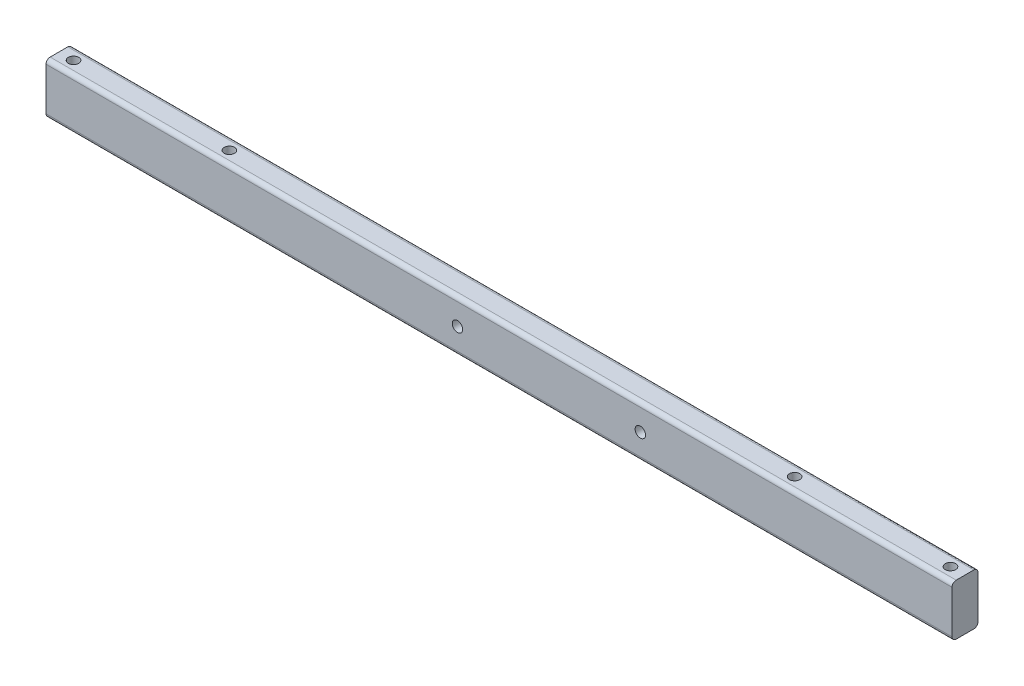
ISO-10303-21;
HEADER;
FILE_DESCRIPTION(('STEP AP214'),'2;1');
FILE_NAME('part.step','',(''),(''),'','','');
FILE_SCHEMA(('AUTOMOTIVE_DESIGN { 1 0 10303 214 1 1 1 1 }'));
ENDSEC;
DATA;
#1=APPLICATION_CONTEXT('core data for automotive mechanical design processes');
#2=APPLICATION_PROTOCOL_DEFINITION('international standard','automotive_design',2000,#1);
#3=PRODUCT_CONTEXT('',#1,'mechanical');
#4=PRODUCT('Part','Part','',(#3));
#5=PRODUCT_RELATED_PRODUCT_CATEGORY('part','',(#4));
#6=PRODUCT_DEFINITION_FORMATION('','',#4);
#7=PRODUCT_DEFINITION_CONTEXT('part definition',#1,'design');
#8=PRODUCT_DEFINITION('design','',#6,#7);
#9=PRODUCT_DEFINITION_SHAPE('','',#8);
#10=(LENGTH_UNIT() NAMED_UNIT(*) SI_UNIT(.MILLI.,.METRE.));
#11=(NAMED_UNIT(*) PLANE_ANGLE_UNIT() SI_UNIT($,.RADIAN.));
#12=(NAMED_UNIT(*) SI_UNIT($,.STERADIAN.) SOLID_ANGLE_UNIT());
#13=UNCERTAINTY_MEASURE_WITH_UNIT(LENGTH_MEASURE(1.E-05),#10,'distance_accuracy_value','');
#14=(GEOMETRIC_REPRESENTATION_CONTEXT(3) GLOBAL_UNCERTAINTY_ASSIGNED_CONTEXT((#13)) GLOBAL_UNIT_ASSIGNED_CONTEXT((#10,
#11,#12)) REPRESENTATION_CONTEXT('',''));
#15=CARTESIAN_POINT('',(0.,0.,0.));
#16=DIRECTION('',(0.,0.,1.));
#17=DIRECTION('',(1.,0.,0.));
#18=AXIS2_PLACEMENT_3D('',#15,#16,#17);
#19=CARTESIAN_POINT('',(0.,0.,6.25));
#20=DIRECTION('',(0.,0.,-1.));
#21=DIRECTION('',(-1.,0.,0.));
#22=AXIS2_PLACEMENT_3D('',#19,#20,#21);
#23=PLANE('',#22);
#24=DIRECTION('',(0.,-1.,0.));
#25=VECTOR('',#24,1.);
#26=CARTESIAN_POINT('',(0.,0.,6.25));
#27=LINE('',#26,#25);
#28=CARTESIAN_POINT('',(0.,11.3,6.25));
#29=VERTEX_POINT('',#28);
#30=CARTESIAN_POINT('',(0.,1.,6.25));
#31=VERTEX_POINT('',#30);
#32=EDGE_CURVE('E108',#29,#31,#27,.T.);
#33=ORIENTED_EDGE('',*,*,#32,.T.);
#34=DIRECTION('',(1.,0.,0.));
#35=VECTOR('',#34,1.);
#36=CARTESIAN_POINT('',(0.,1.,6.25));
#37=LINE('',#36,#35);
#38=CARTESIAN_POINT('',(218.,1.,6.25));
#39=VERTEX_POINT('',#38);
#40=EDGE_CURVE('E11',#31,#39,#37,.T.);
#41=ORIENTED_EDGE('',*,*,#40,.T.);
#42=DIRECTION('',(0.,1.,0.));
#43=VECTOR('',#42,1.);
#44=CARTESIAN_POINT('',(218.,0.,6.25));
#45=LINE('',#44,#43);
#46=CARTESIAN_POINT('',(218.,11.3,6.25));
#47=VERTEX_POINT('',#46);
#48=EDGE_CURVE('E124',#39,#47,#45,.T.);
#49=ORIENTED_EDGE('',*,*,#48,.T.);
#50=DIRECTION('',(-1.,0.,0.));
#51=VECTOR('',#50,1.);
#52=CARTESIAN_POINT('',(0.,11.3,6.25));
#53=LINE('',#52,#51);
#54=EDGE_CURVE('E44',#47,#29,#53,.T.);
#55=ORIENTED_EDGE('',*,*,#54,.T.);
#56=EDGE_LOOP('',(#33,#41,#49,#55));
#57=FACE_BOUND('',#56,.T.);
#58=CARTESIAN_POINT('',(143.,6.15,6.25));
#59=DIRECTION('',(0.,0.,1.));
#60=DIRECTION('',(1.,0.,0.));
#61=AXIS2_PLACEMENT_3D('',#58,#59,#60);
#62=CIRCLE('',#61,1.25000000000001);
#63=CARTESIAN_POINT('',(144.25,6.15,6.25));
#64=VERTEX_POINT('',#63);
#65=EDGE_CURVE('E165',#64,#64,#62,.T.);
#66=ORIENTED_EDGE('',*,*,#65,.F.);
#67=EDGE_LOOP('',(#66));
#68=FACE_BOUND('',#67,.T.);
#69=CARTESIAN_POINT('',(99.,6.15,6.25));
#70=DIRECTION('',(0.,0.,1.));
#71=DIRECTION('',(1.,0.,0.));
#72=AXIS2_PLACEMENT_3D('',#69,#70,#71);
#73=CIRCLE('',#72,1.25);
#74=CARTESIAN_POINT('',(100.25,6.15,6.25));
#75=VERTEX_POINT('',#74);
#76=EDGE_CURVE('E396',#75,#75,#73,.T.);
#77=ORIENTED_EDGE('',*,*,#76,.F.);
#78=EDGE_LOOP('',(#77));
#79=FACE_BOUND('',#78,.T.);
#80=ADVANCED_FACE('F36',(#57,#68,#79),#23,.F.);
#81=CARTESIAN_POINT('',(0.,0.,0.));
#82=DIRECTION('',(0.,0.,-1.));
#83=DIRECTION('',(-1.,0.,0.));
#84=AXIS2_PLACEMENT_3D('',#81,#82,#83);
#85=PLANE('',#84);
#86=CARTESIAN_POINT('',(143.,6.15,0.));
#87=DIRECTION('',(0.,0.,1.));
#88=DIRECTION('',(1.,0.,0.));
#89=AXIS2_PLACEMENT_3D('',#86,#87,#88);
#90=CIRCLE('',#89,1.25000000000001);
#91=CARTESIAN_POINT('',(144.25,6.15,0.));
#92=VERTEX_POINT('',#91);
#93=EDGE_CURVE('E399',#92,#92,#90,.T.);
#94=ORIENTED_EDGE('',*,*,#93,.T.);
#95=EDGE_LOOP('',(#94));
#96=FACE_BOUND('',#95,.T.);
#97=DIRECTION('',(0.,-1.,0.));
#98=VECTOR('',#97,1.);
#99=CARTESIAN_POINT('',(0.,0.,0.));
#100=LINE('',#99,#98);
#101=CARTESIAN_POINT('',(0.,11.3,0.));
#102=VERTEX_POINT('',#101);
#103=CARTESIAN_POINT('',(0.,1.,0.));
#104=VERTEX_POINT('',#103);
#105=EDGE_CURVE('E162',#102,#104,#100,.T.);
#106=ORIENTED_EDGE('',*,*,#105,.F.);
#107=DIRECTION('',(-1.,0.,0.));
#108=VECTOR('',#107,1.);
#109=CARTESIAN_POINT('',(218.,11.3,0.));
#110=LINE('',#109,#108);
#111=CARTESIAN_POINT('',(218.,11.3,0.));
#112=VERTEX_POINT('',#111);
#113=EDGE_CURVE('E143',#102,#112,#110,.F.);
#114=ORIENTED_EDGE('',*,*,#113,.T.);
#115=DIRECTION('',(0.,1.,0.));
#116=VECTOR('',#115,1.);
#117=CARTESIAN_POINT('',(218.,0.,0.));
#118=LINE('',#117,#116);
#119=CARTESIAN_POINT('',(218.,1.,0.));
#120=VERTEX_POINT('',#119);
#121=EDGE_CURVE('E158',#120,#112,#118,.T.);
#122=ORIENTED_EDGE('',*,*,#121,.F.);
#123=DIRECTION('',(1.,0.,0.));
#124=VECTOR('',#123,1.);
#125=CARTESIAN_POINT('',(0.,1.,0.));
#126=LINE('',#125,#124);
#127=EDGE_CURVE('E141',#120,#104,#126,.F.);
#128=ORIENTED_EDGE('',*,*,#127,.T.);
#129=EDGE_LOOP('',(#106,#114,#122,#128));
#130=FACE_BOUND('',#129,.T.);
#131=CARTESIAN_POINT('',(99.,6.15,0.));
#132=DIRECTION('',(0.,0.,1.));
#133=DIRECTION('',(1.,0.,0.));
#134=AXIS2_PLACEMENT_3D('',#131,#132,#133);
#135=CIRCLE('',#134,1.25);
#136=CARTESIAN_POINT('',(100.25,6.15,0.));
#137=VERTEX_POINT('',#136);
#138=EDGE_CURVE('E376',#137,#137,#135,.T.);
#139=ORIENTED_EDGE('',*,*,#138,.T.);
#140=EDGE_LOOP('',(#139));
#141=FACE_BOUND('',#140,.T.);
#142=ADVANCED_FACE('F181',(#96,#130,#141),#85,.T.);
#143=CARTESIAN_POINT('',(0.,0.,6.25));
#144=DIRECTION('',(1.,0.,0.));
#145=DIRECTION('',(0.,0.,-1.));
#146=AXIS2_PLACEMENT_3D('',#143,#144,#145);
#147=PLANE('',#146);
#148=DIRECTION('',(0.,0.,-1.));
#149=VECTOR('',#148,1.);
#150=CARTESIAN_POINT('',(0.,12.3,6.25));
#151=LINE('',#150,#149);
#152=CARTESIAN_POINT('',(0.,12.3,5.25));
#153=VERTEX_POINT('',#152);
#154=CARTESIAN_POINT('',(0.,12.3,1.));
#155=VERTEX_POINT('',#154);
#156=EDGE_CURVE('E106',#153,#155,#151,.T.);
#157=ORIENTED_EDGE('',*,*,#156,.T.);
#158=CARTESIAN_POINT('',(0.,11.3,1.));
#159=DIRECTION('',(1.,0.,0.));
#160=DIRECTION('',(0.,0.,-1.));
#161=AXIS2_PLACEMENT_3D('',#158,#159,#160);
#162=CIRCLE('',#161,1.);
#163=EDGE_CURVE('E139',#155,#102,#162,.F.);
#164=ORIENTED_EDGE('',*,*,#163,.T.);
#165=ORIENTED_EDGE('',*,*,#105,.T.);
#166=CARTESIAN_POINT('',(0.,1.,1.));
#167=DIRECTION('',(1.,0.,0.));
#168=DIRECTION('',(0.,0.,-1.));
#169=AXIS2_PLACEMENT_3D('',#166,#167,#168);
#170=CIRCLE('',#169,1.);
#171=CARTESIAN_POINT('',(0.,0.,1.));
#172=VERTEX_POINT('',#171);
#173=EDGE_CURVE('E137',#104,#172,#170,.F.);
#174=ORIENTED_EDGE('',*,*,#173,.T.);
#175=DIRECTION('',(0.,0.,-1.));
#176=VECTOR('',#175,1.);
#177=CARTESIAN_POINT('',(0.,0.,6.25));
#178=LINE('',#177,#176);
#179=CARTESIAN_POINT('',(0.,0.,5.25));
#180=VERTEX_POINT('',#179);
#181=EDGE_CURVE('E128',#180,#172,#178,.T.);
#182=ORIENTED_EDGE('',*,*,#181,.F.);
#183=CARTESIAN_POINT('',(0.,1.,5.25));
#184=DIRECTION('',(1.,0.,0.));
#185=DIRECTION('',(0.,0.,-1.));
#186=AXIS2_PLACEMENT_3D('',#183,#184,#185);
#187=CIRCLE('',#186,1.);
#188=EDGE_CURVE('E113',#180,#31,#187,.F.);
#189=ORIENTED_EDGE('',*,*,#188,.T.);
#190=ORIENTED_EDGE('',*,*,#32,.F.);
#191=CARTESIAN_POINT('',(0.,11.3,5.25));
#192=DIRECTION('',(1.,0.,0.));
#193=DIRECTION('',(0.,0.,-1.));
#194=AXIS2_PLACEMENT_3D('',#191,#192,#193);
#195=CIRCLE('',#194,1.);
#196=EDGE_CURVE('E103',#29,#153,#195,.F.);
#197=ORIENTED_EDGE('',*,*,#196,.T.);
#198=EDGE_LOOP('',(#157,#164,#165,#174,#182,#189,#190,#197));
#199=FACE_BOUND('',#198,.T.);
#200=ADVANCED_FACE('F105',(#199),#147,.F.);
#201=CARTESIAN_POINT('',(0.,0.,6.25));
#202=DIRECTION('',(0.,1.,0.));
#203=DIRECTION('',(0.,0.,1.));
#204=AXIS2_PLACEMENT_3D('',#201,#202,#203);
#205=PLANE('',#204);
#206=ORIENTED_EDGE('',*,*,#181,.T.);
#207=DIRECTION('',(1.,0.,0.));
#208=VECTOR('',#207,1.);
#209=CARTESIAN_POINT('',(218.,0.,1.));
#210=LINE('',#209,#208);
#211=CARTESIAN_POINT('',(218.,0.,1.));
#212=VERTEX_POINT('',#211);
#213=EDGE_CURVE('E152',#172,#212,#210,.T.);
#214=ORIENTED_EDGE('',*,*,#213,.T.);
#215=DIRECTION('',(0.,0.,-1.));
#216=VECTOR('',#215,1.);
#217=CARTESIAN_POINT('',(218.,0.,6.25));
#218=LINE('',#217,#216);
#219=CARTESIAN_POINT('',(218.,0.,5.25));
#220=VERTEX_POINT('',#219);
#221=EDGE_CURVE('E132',#220,#212,#218,.T.);
#222=ORIENTED_EDGE('',*,*,#221,.F.);
#223=DIRECTION('',(1.,0.,0.));
#224=VECTOR('',#223,1.);
#225=CARTESIAN_POINT('',(0.,0.,5.25));
#226=LINE('',#225,#224);
#227=EDGE_CURVE('E150',#220,#180,#226,.F.);
#228=ORIENTED_EDGE('',*,*,#227,.T.);
#229=EDGE_LOOP('',(#206,#214,#222,#228));
#230=FACE_BOUND('',#229,.T.);
#231=ADVANCED_FACE('F172',(#230),#205,.F.);
#232=CARTESIAN_POINT('',(218.,0.,6.25));
#233=DIRECTION('',(-1.,0.,0.));
#234=DIRECTION('',(0.,0.,1.));
#235=AXIS2_PLACEMENT_3D('',#232,#233,#234);
#236=PLANE('',#235);
#237=ORIENTED_EDGE('',*,*,#121,.T.);
#238=CARTESIAN_POINT('',(218.,11.3,1.));
#239=DIRECTION('',(-1.,0.,0.));
#240=DIRECTION('',(0.,0.,1.));
#241=AXIS2_PLACEMENT_3D('',#238,#239,#240);
#242=CIRCLE('',#241,1.);
#243=CARTESIAN_POINT('',(218.,12.3,1.));
#244=VERTEX_POINT('',#243);
#245=EDGE_CURVE('E148',#112,#244,#242,.F.);
#246=ORIENTED_EDGE('',*,*,#245,.T.);
#247=DIRECTION('',(0.,0.,-1.));
#248=VECTOR('',#247,1.);
#249=CARTESIAN_POINT('',(218.,12.3,6.25));
#250=LINE('',#249,#248);
#251=CARTESIAN_POINT('',(218.,12.3,5.25));
#252=VERTEX_POINT('',#251);
#253=EDGE_CURVE('E123',#252,#244,#250,.T.);
#254=ORIENTED_EDGE('',*,*,#253,.F.);
#255=CARTESIAN_POINT('',(218.,11.3,5.25));
#256=DIRECTION('',(-1.,0.,0.));
#257=DIRECTION('',(0.,0.,1.));
#258=AXIS2_PLACEMENT_3D('',#255,#256,#257);
#259=CIRCLE('',#258,1.);
#260=EDGE_CURVE('E127',#252,#47,#259,.F.);
#261=ORIENTED_EDGE('',*,*,#260,.T.);
#262=ORIENTED_EDGE('',*,*,#48,.F.);
#263=CARTESIAN_POINT('',(218.,1.,5.25));
#264=DIRECTION('',(-1.,0.,0.));
#265=DIRECTION('',(0.,0.,1.));
#266=AXIS2_PLACEMENT_3D('',#263,#264,#265);
#267=CIRCLE('',#266,1.);
#268=EDGE_CURVE('E59',#39,#220,#267,.F.);
#269=ORIENTED_EDGE('',*,*,#268,.T.);
#270=ORIENTED_EDGE('',*,*,#221,.T.);
#271=CARTESIAN_POINT('',(218.,1.,1.));
#272=DIRECTION('',(-1.,0.,0.));
#273=DIRECTION('',(0.,0.,1.));
#274=AXIS2_PLACEMENT_3D('',#271,#272,#273);
#275=CIRCLE('',#274,1.);
#276=EDGE_CURVE('E51',#212,#120,#275,.F.);
#277=ORIENTED_EDGE('',*,*,#276,.T.);
#278=EDGE_LOOP('',(#237,#246,#254,#261,#262,#269,#270,#277));
#279=FACE_BOUND('',#278,.T.);
#280=ADVANCED_FACE('F168',(#279),#236,.F.);
#281=CARTESIAN_POINT('',(0.,12.3,6.25));
#282=DIRECTION('',(0.,-1.,0.));
#283=DIRECTION('',(0.,0.,-1.));
#284=AXIS2_PLACEMENT_3D('',#281,#282,#283);
#285=PLANE('',#284);
#286=CARTESIAN_POINT('',(214.5,12.3,3.12499999999999));
#287=DIRECTION('',(0.,1.,0.));
#288=DIRECTION('',(0.,0.,1.));
#289=AXIS2_PLACEMENT_3D('',#286,#287,#288);
#290=CIRCLE('',#289,1.25000000000001);
#291=CARTESIAN_POINT('',(214.5,12.3,4.375));
#292=VERTEX_POINT('',#291);
#293=EDGE_CURVE('E373',#292,#292,#290,.T.);
#294=ORIENTED_EDGE('',*,*,#293,.F.);
#295=EDGE_LOOP('',(#294));
#296=FACE_BOUND('',#295,.T.);
#297=CARTESIAN_POINT('',(41.,12.3,3.12499999999999));
#298=DIRECTION('',(0.,1.,0.));
#299=DIRECTION('',(0.,0.,-1.));
#300=AXIS2_PLACEMENT_3D('',#297,#298,#299);
#301=CIRCLE('',#300,1.25000000000001);
#302=CARTESIAN_POINT('',(41.,12.3,1.87499999999998));
#303=VERTEX_POINT('',#302);
#304=EDGE_CURVE('E386',#303,#303,#301,.T.);
#305=ORIENTED_EDGE('',*,*,#304,.F.);
#306=EDGE_LOOP('',(#305));
#307=FACE_BOUND('',#306,.T.);
#308=CARTESIAN_POINT('',(3.5,12.3,3.12499999999999));
#309=DIRECTION('',(0.,1.,0.));
#310=DIRECTION('',(0.,0.,-1.));
#311=AXIS2_PLACEMENT_3D('',#308,#309,#310);
#312=CIRCLE('',#311,1.25000000000001);
#313=CARTESIAN_POINT('',(3.5,12.3,1.87499999999998));
#314=VERTEX_POINT('',#313);
#315=EDGE_CURVE('E385',#314,#314,#312,.T.);
#316=ORIENTED_EDGE('',*,*,#315,.F.);
#317=EDGE_LOOP('',(#316));
#318=FACE_BOUND('',#317,.T.);
#319=CARTESIAN_POINT('',(177.,12.3,3.12499999999999));
#320=DIRECTION('',(0.,1.,0.));
#321=DIRECTION('',(0.,0.,1.));
#322=AXIS2_PLACEMENT_3D('',#319,#320,#321);
#323=CIRCLE('',#322,1.25000000000001);
#324=CARTESIAN_POINT('',(177.,12.3,4.375));
#325=VERTEX_POINT('',#324);
#326=EDGE_CURVE('E379',#325,#325,#323,.T.);
#327=ORIENTED_EDGE('',*,*,#326,.F.);
#328=EDGE_LOOP('',(#327));
#329=FACE_BOUND('',#328,.T.);
#330=ORIENTED_EDGE('',*,*,#253,.T.);
#331=DIRECTION('',(-1.,0.,0.));
#332=VECTOR('',#331,1.);
#333=CARTESIAN_POINT('',(0.,12.3,1.));
#334=LINE('',#333,#332);
#335=EDGE_CURVE('E114',#244,#155,#334,.T.);
#336=ORIENTED_EDGE('',*,*,#335,.T.);
#337=ORIENTED_EDGE('',*,*,#156,.F.);
#338=DIRECTION('',(-1.,0.,0.));
#339=VECTOR('',#338,1.);
#340=CARTESIAN_POINT('',(0.,12.3,5.25));
#341=LINE('',#340,#339);
#342=EDGE_CURVE('E120',#153,#252,#341,.F.);
#343=ORIENTED_EDGE('',*,*,#342,.T.);
#344=EDGE_LOOP('',(#330,#336,#337,#343));
#345=FACE_BOUND('',#344,.T.);
#346=ADVANCED_FACE('F119',(#296,#307,#318,#329,#345),#285,.F.);
#347=CARTESIAN_POINT('',(143.,6.15,6.25));
#348=DIRECTION('',(0.,0.,-1.));
#349=DIRECTION('',(-1.,0.,0.));
#350=AXIS2_PLACEMENT_3D('',#347,#348,#349);
#351=CYLINDRICAL_SURFACE('',#350,1.25000000000001);
#352=ORIENTED_EDGE('',*,*,#65,.T.);
#353=EDGE_LOOP('',(#352));
#354=FACE_BOUND('',#353,.T.);
#355=ORIENTED_EDGE('',*,*,#93,.F.);
#356=EDGE_LOOP('',(#355));
#357=FACE_BOUND('',#356,.T.);
#358=ADVANCED_FACE('F207',(#354,#357),#351,.F.);
#359=CARTESIAN_POINT('',(99.,6.15,6.25));
#360=DIRECTION('',(0.,0.,-1.));
#361=DIRECTION('',(-1.,0.,0.));
#362=AXIS2_PLACEMENT_3D('',#359,#360,#361);
#363=CYLINDRICAL_SURFACE('',#362,1.25);
#364=ORIENTED_EDGE('',*,*,#76,.T.);
#365=EDGE_LOOP('',(#364));
#366=FACE_BOUND('',#365,.T.);
#367=ORIENTED_EDGE('',*,*,#138,.F.);
#368=EDGE_LOOP('',(#367));
#369=FACE_BOUND('',#368,.T.);
#370=ADVANCED_FACE('F239',(#366,#369),#363,.F.);
#371=CARTESIAN_POINT('',(177.,4.3,3.12499999999999));
#372=DIRECTION('',(0.,1.,0.));
#373=DIRECTION('',(0.,0.,1.));
#374=AXIS2_PLACEMENT_3D('',#371,#372,#373);
#375=CYLINDRICAL_SURFACE('',#374,1.25000000000001);
#376=CARTESIAN_POINT('',(177.,4.3,3.12499999999999));
#377=DIRECTION('',(0.,1.,0.));
#378=DIRECTION('',(0.,0.,1.));
#379=AXIS2_PLACEMENT_3D('',#376,#377,#378);
#380=CIRCLE('',#379,1.25000000000001);
#381=CARTESIAN_POINT('',(177.,4.3,4.375));
#382=VERTEX_POINT('',#381);
#383=EDGE_CURVE('E374',#382,#382,#380,.T.);
#384=ORIENTED_EDGE('',*,*,#383,.F.);
#385=EDGE_LOOP('',(#384));
#386=FACE_BOUND('',#385,.T.);
#387=ORIENTED_EDGE('',*,*,#326,.T.);
#388=EDGE_LOOP('',(#387));
#389=FACE_BOUND('',#388,.T.);
#390=ADVANCED_FACE('F246',(#386,#389),#375,.F.);
#391=CARTESIAN_POINT('',(177.,4.3,3.12499999999999));
#392=DIRECTION('',(0.,1.,0.));
#393=DIRECTION('',(0.,0.,1.));
#394=AXIS2_PLACEMENT_3D('',#391,#392,#393);
#395=PLANE('',#394);
#396=ORIENTED_EDGE('',*,*,#383,.T.);
#397=EDGE_LOOP('',(#396));
#398=FACE_BOUND('',#397,.T.);
#399=ADVANCED_FACE('F253',(#398),#395,.T.);
#400=CARTESIAN_POINT('',(3.5,4.3,3.12499999999999));
#401=DIRECTION('',(0.,1.,0.));
#402=DIRECTION('',(0.,0.,1.));
#403=AXIS2_PLACEMENT_3D('',#400,#401,#402);
#404=CYLINDRICAL_SURFACE('',#403,1.25000000000001);
#405=CARTESIAN_POINT('',(3.5,4.3,3.12499999999999));
#406=DIRECTION('',(0.,1.,0.));
#407=DIRECTION('',(0.,0.,-1.));
#408=AXIS2_PLACEMENT_3D('',#405,#406,#407);
#409=CIRCLE('',#408,1.25000000000001);
#410=CARTESIAN_POINT('',(3.5,4.3,1.87499999999998));
#411=VERTEX_POINT('',#410);
#412=EDGE_CURVE('E391',#411,#411,#409,.T.);
#413=ORIENTED_EDGE('',*,*,#412,.F.);
#414=EDGE_LOOP('',(#413));
#415=FACE_BOUND('',#414,.T.);
#416=ORIENTED_EDGE('',*,*,#315,.T.);
#417=EDGE_LOOP('',(#416));
#418=FACE_BOUND('',#417,.T.);
#419=ADVANCED_FACE('F261',(#415,#418),#404,.F.);
#420=CARTESIAN_POINT('',(3.5,4.3,3.12499999999999));
#421=DIRECTION('',(0.,-1.,0.));
#422=DIRECTION('',(0.,0.,-1.));
#423=AXIS2_PLACEMENT_3D('',#420,#421,#422);
#424=PLANE('',#423);
#425=ORIENTED_EDGE('',*,*,#412,.T.);
#426=EDGE_LOOP('',(#425));
#427=FACE_BOUND('',#426,.T.);
#428=ADVANCED_FACE('F269',(#427),#424,.F.);
#429=CARTESIAN_POINT('',(41.,4.3,3.12499999999999));
#430=DIRECTION('',(0.,1.,0.));
#431=DIRECTION('',(0.,0.,1.));
#432=AXIS2_PLACEMENT_3D('',#429,#430,#431);
#433=CYLINDRICAL_SURFACE('',#432,1.25000000000001);
#434=CARTESIAN_POINT('',(41.,4.3,3.12499999999999));
#435=DIRECTION('',(0.,1.,0.));
#436=DIRECTION('',(0.,0.,-1.));
#437=AXIS2_PLACEMENT_3D('',#434,#435,#436);
#438=CIRCLE('',#437,1.25000000000001);
#439=CARTESIAN_POINT('',(41.,4.3,1.87499999999998));
#440=VERTEX_POINT('',#439);
#441=EDGE_CURVE('E382',#440,#440,#438,.T.);
#442=ORIENTED_EDGE('',*,*,#441,.F.);
#443=EDGE_LOOP('',(#442));
#444=FACE_BOUND('',#443,.T.);
#445=ORIENTED_EDGE('',*,*,#304,.T.);
#446=EDGE_LOOP('',(#445));
#447=FACE_BOUND('',#446,.T.);
#448=ADVANCED_FACE('F277',(#444,#447),#433,.F.);
#449=CARTESIAN_POINT('',(41.,4.3,3.12499999999999));
#450=DIRECTION('',(0.,-1.,0.));
#451=DIRECTION('',(0.,0.,-1.));
#452=AXIS2_PLACEMENT_3D('',#449,#450,#451);
#453=PLANE('',#452);
#454=ORIENTED_EDGE('',*,*,#441,.T.);
#455=EDGE_LOOP('',(#454));
#456=FACE_BOUND('',#455,.T.);
#457=ADVANCED_FACE('F285',(#456),#453,.F.);
#458=CARTESIAN_POINT('',(214.5,4.3,3.12499999999999));
#459=DIRECTION('',(0.,1.,0.));
#460=DIRECTION('',(0.,0.,1.));
#461=AXIS2_PLACEMENT_3D('',#458,#459,#460);
#462=CYLINDRICAL_SURFACE('',#461,1.25000000000001);
#463=CARTESIAN_POINT('',(214.5,4.3,3.12499999999999));
#464=DIRECTION('',(0.,1.,0.));
#465=DIRECTION('',(0.,0.,1.));
#466=AXIS2_PLACEMENT_3D('',#463,#464,#465);
#467=CIRCLE('',#466,1.25000000000001);
#468=CARTESIAN_POINT('',(214.5,4.3,4.375));
#469=VERTEX_POINT('',#468);
#470=EDGE_CURVE('E370',#469,#469,#467,.T.);
#471=ORIENTED_EDGE('',*,*,#470,.F.);
#472=EDGE_LOOP('',(#471));
#473=FACE_BOUND('',#472,.T.);
#474=ORIENTED_EDGE('',*,*,#293,.T.);
#475=EDGE_LOOP('',(#474));
#476=FACE_BOUND('',#475,.T.);
#477=ADVANCED_FACE('F195',(#473,#476),#462,.F.);
#478=CARTESIAN_POINT('',(214.5,4.3,3.12499999999999));
#479=DIRECTION('',(0.,1.,0.));
#480=DIRECTION('',(0.,0.,1.));
#481=AXIS2_PLACEMENT_3D('',#478,#479,#480);
#482=PLANE('',#481);
#483=ORIENTED_EDGE('',*,*,#470,.T.);
#484=EDGE_LOOP('',(#483));
#485=FACE_BOUND('',#484,.T.);
#486=ADVANCED_FACE('F188',(#485),#482,.T.);
#487=CARTESIAN_POINT('',(0.,11.3,1.));
#488=DIRECTION('',(1.,0.,0.));
#489=DIRECTION('',(0.,0.,-1.));
#490=AXIS2_PLACEMENT_3D('',#487,#488,#489);
#491=CYLINDRICAL_SURFACE('',#490,1.);
#492=ORIENTED_EDGE('',*,*,#245,.F.);
#493=ORIENTED_EDGE('',*,*,#113,.F.);
#494=ORIENTED_EDGE('',*,*,#163,.F.);
#495=ORIENTED_EDGE('',*,*,#335,.F.);
#496=EDGE_LOOP('',(#492,#493,#494,#495));
#497=FACE_BOUND('',#496,.T.);
#498=ADVANCED_FACE('F186',(#497),#491,.T.);
#499=CARTESIAN_POINT('',(0.,1.,1.));
#500=DIRECTION('',(-1.,0.,0.));
#501=DIRECTION('',(0.,0.,1.));
#502=AXIS2_PLACEMENT_3D('',#499,#500,#501);
#503=CYLINDRICAL_SURFACE('',#502,1.);
#504=ORIENTED_EDGE('',*,*,#173,.F.);
#505=ORIENTED_EDGE('',*,*,#127,.F.);
#506=ORIENTED_EDGE('',*,*,#276,.F.);
#507=ORIENTED_EDGE('',*,*,#213,.F.);
#508=EDGE_LOOP('',(#504,#505,#506,#507));
#509=FACE_BOUND('',#508,.T.);
#510=ADVANCED_FACE('F178',(#509),#503,.T.);
#511=CARTESIAN_POINT('',(0.,1.,5.25));
#512=DIRECTION('',(1.,0.,0.));
#513=DIRECTION('',(0.,0.,-1.));
#514=AXIS2_PLACEMENT_3D('',#511,#512,#513);
#515=CYLINDRICAL_SURFACE('',#514,1.);
#516=ORIENTED_EDGE('',*,*,#188,.F.);
#517=ORIENTED_EDGE('',*,*,#227,.F.);
#518=ORIENTED_EDGE('',*,*,#268,.F.);
#519=ORIENTED_EDGE('',*,*,#40,.F.);
#520=EDGE_LOOP('',(#516,#517,#518,#519));
#521=FACE_BOUND('',#520,.T.);
#522=ADVANCED_FACE('F176',(#521),#515,.T.);
#523=CARTESIAN_POINT('',(0.,11.3,5.25));
#524=DIRECTION('',(-1.,0.,0.));
#525=DIRECTION('',(0.,0.,1.));
#526=AXIS2_PLACEMENT_3D('',#523,#524,#525);
#527=CYLINDRICAL_SURFACE('',#526,1.);
#528=ORIENTED_EDGE('',*,*,#260,.F.);
#529=ORIENTED_EDGE('',*,*,#342,.F.);
#530=ORIENTED_EDGE('',*,*,#196,.F.);
#531=ORIENTED_EDGE('',*,*,#54,.F.);
#532=EDGE_LOOP('',(#528,#529,#530,#531));
#533=FACE_BOUND('',#532,.T.);
#534=ADVANCED_FACE('F38',(#533),#527,.T.);
#535=CLOSED_SHELL('',(#80,#142,#200,#231,#280,#346,#358,#370,#390,#399,#419,#428,#448,#457,#477,
#486,#498,#510,#522,#534));
#536=MANIFOLD_SOLID_BREP('B2',#535);
#537=ADVANCED_BREP_SHAPE_REPRESENTATION('',(#18,#536),#14);
#538=SHAPE_DEFINITION_REPRESENTATION(#9,#537);
ENDSEC;
END-ISO-10303-21;
